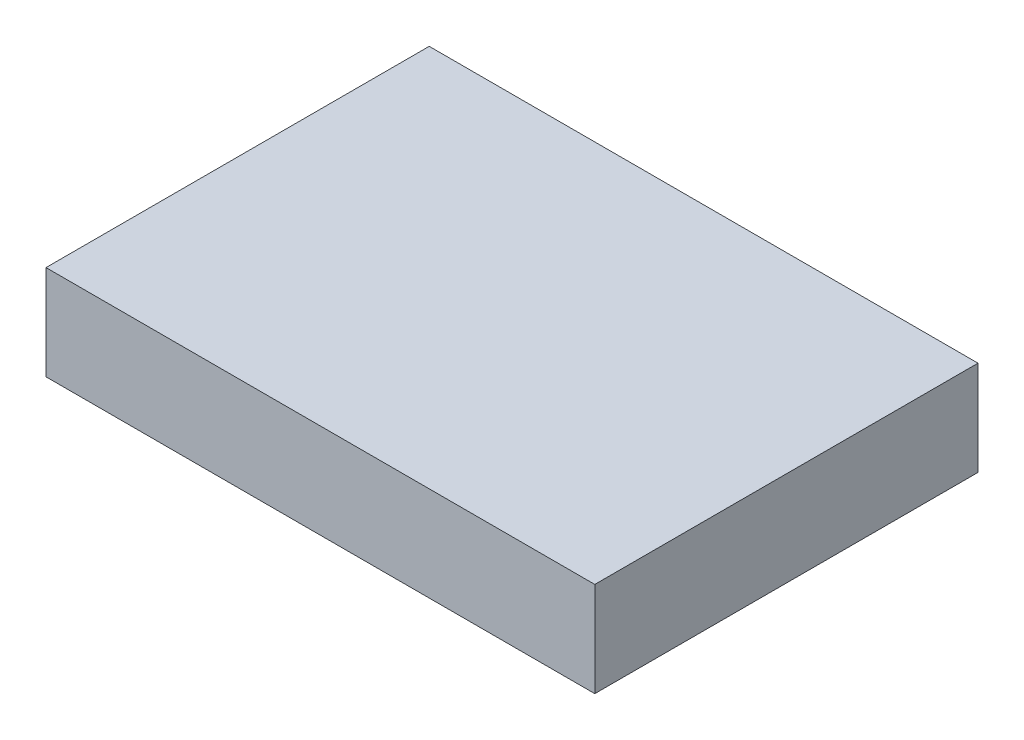
ISO-10303-21;
HEADER;
FILE_DESCRIPTION(('STEP AP214'),'2;1');
FILE_NAME('part.step','',(''),(''),'','','');
FILE_SCHEMA(('AUTOMOTIVE_DESIGN { 1 0 10303 214 1 1 1 1 }'));
ENDSEC;
DATA;
#1=APPLICATION_CONTEXT('core data for automotive mechanical design processes');
#2=APPLICATION_PROTOCOL_DEFINITION('international standard','automotive_design',2000,#1);
#3=PRODUCT_CONTEXT('',#1,'mechanical');
#4=PRODUCT('Part','Part','',(#3));
#5=PRODUCT_RELATED_PRODUCT_CATEGORY('part','',(#4));
#6=PRODUCT_DEFINITION_FORMATION('','',#4);
#7=PRODUCT_DEFINITION_CONTEXT('part definition',#1,'design');
#8=PRODUCT_DEFINITION('design','',#6,#7);
#9=PRODUCT_DEFINITION_SHAPE('','',#8);
#10=(LENGTH_UNIT() NAMED_UNIT(*) SI_UNIT(.MILLI.,.METRE.));
#11=(NAMED_UNIT(*) PLANE_ANGLE_UNIT() SI_UNIT($,.RADIAN.));
#12=(NAMED_UNIT(*) SI_UNIT($,.STERADIAN.) SOLID_ANGLE_UNIT());
#13=UNCERTAINTY_MEASURE_WITH_UNIT(LENGTH_MEASURE(1.E-05),#10,'distance_accuracy_value','');
#14=(GEOMETRIC_REPRESENTATION_CONTEXT(3) GLOBAL_UNCERTAINTY_ASSIGNED_CONTEXT((#13)) GLOBAL_UNIT_ASSIGNED_CONTEXT((#10,
#11,#12)) REPRESENTATION_CONTEXT('',''));
#15=CARTESIAN_POINT('',(0.,0.,0.));
#16=DIRECTION('',(0.,0.,1.));
#17=DIRECTION('',(1.,0.,0.));
#18=AXIS2_PLACEMENT_3D('',#15,#16,#17);
#19=CARTESIAN_POINT('',(-58.,20.,-40.5));
#20=DIRECTION('',(1.,0.,0.));
#21=DIRECTION('',(0.,0.,-1.));
#22=AXIS2_PLACEMENT_3D('',#19,#20,#21);
#23=PLANE('',#22);
#24=DIRECTION('',(0.,0.,1.));
#25=VECTOR('',#24,1.);
#26=CARTESIAN_POINT('',(-58.,0.,-40.5));
#27=LINE('',#26,#25);
#28=CARTESIAN_POINT('',(-58.,0.,-40.5));
#29=VERTEX_POINT('',#28);
#30=CARTESIAN_POINT('',(-58.,0.,40.5));
#31=VERTEX_POINT('',#30);
#32=EDGE_CURVE('E107',#29,#31,#27,.T.);
#33=ORIENTED_EDGE('',*,*,#32,.T.);
#34=DIRECTION('',(0.,-1.,0.));
#35=VECTOR('',#34,1.);
#36=CARTESIAN_POINT('',(-58.,20.,40.5));
#37=LINE('',#36,#35);
#38=CARTESIAN_POINT('',(-58.,20.,40.5));
#39=VERTEX_POINT('',#38);
#40=EDGE_CURVE('E11',#39,#31,#37,.T.);
#41=ORIENTED_EDGE('',*,*,#40,.F.);
#42=DIRECTION('',(0.,0.,1.));
#43=VECTOR('',#42,1.);
#44=CARTESIAN_POINT('',(-58.,20.,-40.5));
#45=LINE('',#44,#43);
#46=CARTESIAN_POINT('',(-58.,20.,-40.5));
#47=VERTEX_POINT('',#46);
#48=EDGE_CURVE('E91',#47,#39,#45,.T.);
#49=ORIENTED_EDGE('',*,*,#48,.F.);
#50=DIRECTION('',(0.,-1.,0.));
#51=VECTOR('',#50,1.);
#52=CARTESIAN_POINT('',(-58.,20.,-40.5));
#53=LINE('',#52,#51);
#54=EDGE_CURVE('E103',#47,#29,#53,.T.);
#55=ORIENTED_EDGE('',*,*,#54,.T.);
#56=EDGE_LOOP('',(#33,#41,#49,#55));
#57=FACE_BOUND('',#56,.T.);
#58=ADVANCED_FACE('F39',(#57),#23,.F.);
#59=CARTESIAN_POINT('',(-58.,20.,40.5));
#60=DIRECTION('',(0.,0.,-1.));
#61=DIRECTION('',(-1.,0.,0.));
#62=AXIS2_PLACEMENT_3D('',#59,#60,#61);
#63=PLANE('',#62);
#64=DIRECTION('',(1.,0.,0.));
#65=VECTOR('',#64,1.);
#66=CARTESIAN_POINT('',(-58.,0.,40.5));
#67=LINE('',#66,#65);
#68=CARTESIAN_POINT('',(58.,0.,40.5));
#69=VERTEX_POINT('',#68);
#70=EDGE_CURVE('E96',#31,#69,#67,.T.);
#71=ORIENTED_EDGE('',*,*,#70,.T.);
#72=DIRECTION('',(0.,-1.,0.));
#73=VECTOR('',#72,1.);
#74=CARTESIAN_POINT('',(58.,20.,40.5));
#75=LINE('',#74,#73);
#76=CARTESIAN_POINT('',(58.,20.,40.5));
#77=VERTEX_POINT('',#76);
#78=EDGE_CURVE('E48',#77,#69,#75,.T.);
#79=ORIENTED_EDGE('',*,*,#78,.F.);
#80=DIRECTION('',(1.,0.,0.));
#81=VECTOR('',#80,1.);
#82=CARTESIAN_POINT('',(-58.,20.,40.5));
#83=LINE('',#82,#81);
#84=EDGE_CURVE('E86',#39,#77,#83,.T.);
#85=ORIENTED_EDGE('',*,*,#84,.F.);
#86=ORIENTED_EDGE('',*,*,#40,.T.);
#87=EDGE_LOOP('',(#71,#79,#85,#86));
#88=FACE_BOUND('',#87,.T.);
#89=ADVANCED_FACE('F95',(#88),#63,.F.);
#90=CARTESIAN_POINT('',(58.,20.,-40.5));
#91=DIRECTION('',(-1.,0.,0.));
#92=DIRECTION('',(0.,0.,1.));
#93=AXIS2_PLACEMENT_3D('',#90,#91,#92);
#94=PLANE('',#93);
#95=DIRECTION('',(0.,0.,-1.));
#96=VECTOR('',#95,1.);
#97=CARTESIAN_POINT('',(58.,0.,-40.5));
#98=LINE('',#97,#96);
#99=CARTESIAN_POINT('',(58.,0.,-40.5));
#100=VERTEX_POINT('',#99);
#101=EDGE_CURVE('E73',#69,#100,#98,.T.);
#102=ORIENTED_EDGE('',*,*,#101,.T.);
#103=DIRECTION('',(0.,-1.,0.));
#104=VECTOR('',#103,1.);
#105=CARTESIAN_POINT('',(58.,20.,-40.5));
#106=LINE('',#105,#104);
#107=CARTESIAN_POINT('',(58.,20.,-40.5));
#108=VERTEX_POINT('',#107);
#109=EDGE_CURVE('E98',#108,#100,#106,.T.);
#110=ORIENTED_EDGE('',*,*,#109,.F.);
#111=DIRECTION('',(0.,0.,-1.));
#112=VECTOR('',#111,1.);
#113=CARTESIAN_POINT('',(58.,20.,-40.5));
#114=LINE('',#113,#112);
#115=EDGE_CURVE('E89',#77,#108,#114,.T.);
#116=ORIENTED_EDGE('',*,*,#115,.F.);
#117=ORIENTED_EDGE('',*,*,#78,.T.);
#118=EDGE_LOOP('',(#102,#110,#116,#117));
#119=FACE_BOUND('',#118,.T.);
#120=ADVANCED_FACE('F99',(#119),#94,.F.);
#121=CARTESIAN_POINT('',(-58.,20.,-40.5));
#122=DIRECTION('',(0.,0.,1.));
#123=DIRECTION('',(1.,0.,0.));
#124=AXIS2_PLACEMENT_3D('',#121,#122,#123);
#125=PLANE('',#124);
#126=DIRECTION('',(-1.,0.,0.));
#127=VECTOR('',#126,1.);
#128=CARTESIAN_POINT('',(-58.,0.,-40.5));
#129=LINE('',#128,#127);
#130=EDGE_CURVE('E79',#100,#29,#129,.T.);
#131=ORIENTED_EDGE('',*,*,#130,.T.);
#132=ORIENTED_EDGE('',*,*,#54,.F.);
#133=DIRECTION('',(-1.,0.,0.));
#134=VECTOR('',#133,1.);
#135=CARTESIAN_POINT('',(-58.,20.,-40.5));
#136=LINE('',#135,#134);
#137=EDGE_CURVE('E56',#108,#47,#136,.T.);
#138=ORIENTED_EDGE('',*,*,#137,.F.);
#139=ORIENTED_EDGE('',*,*,#109,.T.);
#140=EDGE_LOOP('',(#131,#132,#138,#139));
#141=FACE_BOUND('',#140,.T.);
#142=ADVANCED_FACE('F120',(#141),#125,.F.);
#143=CARTESIAN_POINT('',(0.,20.,0.));
#144=DIRECTION('',(0.,1.,0.));
#145=DIRECTION('',(0.,0.,1.));
#146=AXIS2_PLACEMENT_3D('',#143,#144,#145);
#147=PLANE('',#146);
#148=ORIENTED_EDGE('',*,*,#48,.T.);
#149=ORIENTED_EDGE('',*,*,#84,.T.);
#150=ORIENTED_EDGE('',*,*,#115,.T.);
#151=ORIENTED_EDGE('',*,*,#137,.T.);
#152=EDGE_LOOP('',(#148,#149,#150,#151));
#153=FACE_BOUND('',#152,.T.);
#154=ADVANCED_FACE('F87',(#153),#147,.T.);
#155=CARTESIAN_POINT('',(0.,0.,0.));
#156=DIRECTION('',(0.,1.,0.));
#157=DIRECTION('',(0.,0.,1.));
#158=AXIS2_PLACEMENT_3D('',#155,#156,#157);
#159=PLANE('',#158);
#160=ORIENTED_EDGE('',*,*,#32,.F.);
#161=ORIENTED_EDGE('',*,*,#130,.F.);
#162=ORIENTED_EDGE('',*,*,#101,.F.);
#163=ORIENTED_EDGE('',*,*,#70,.F.);
#164=EDGE_LOOP('',(#160,#161,#162,#163));
#165=FACE_BOUND('',#164,.T.);
#166=ADVANCED_FACE('F123',(#165),#159,.F.);
#167=CLOSED_SHELL('',(#58,#89,#120,#142,#154,#166));
#168=MANIFOLD_SOLID_BREP('B2',#167);
#169=ADVANCED_BREP_SHAPE_REPRESENTATION('',(#18,#168),#14);
#170=SHAPE_DEFINITION_REPRESENTATION(#9,#169);
ENDSEC;
END-ISO-10303-21;
